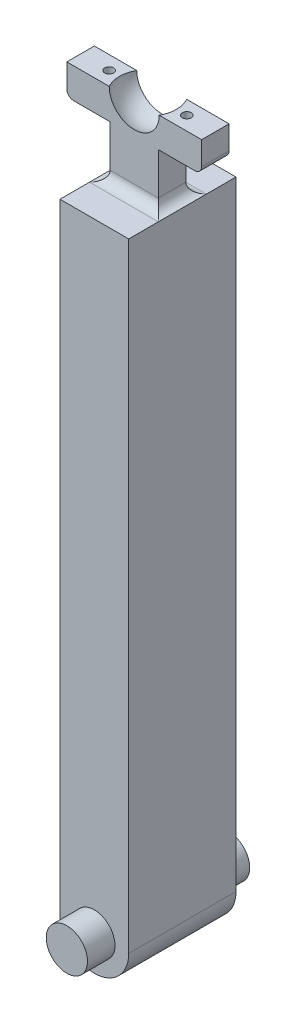
ISO-10303-21;
HEADER;
FILE_DESCRIPTION(('STEP AP214'),'2;1');
FILE_NAME('part.step','',(''),(''),'','','');
FILE_SCHEMA(('AUTOMOTIVE_DESIGN { 1 0 10303 214 1 1 1 1 }'));
ENDSEC;
DATA;
#1=APPLICATION_CONTEXT('core data for automotive mechanical design processes');
#2=APPLICATION_PROTOCOL_DEFINITION('international standard','automotive_design',2000,#1);
#3=PRODUCT_CONTEXT('',#1,'mechanical');
#4=PRODUCT('Part','Part','',(#3));
#5=PRODUCT_RELATED_PRODUCT_CATEGORY('part','',(#4));
#6=PRODUCT_DEFINITION_FORMATION('','',#4);
#7=PRODUCT_DEFINITION_CONTEXT('part definition',#1,'design');
#8=PRODUCT_DEFINITION('design','',#6,#7);
#9=PRODUCT_DEFINITION_SHAPE('','',#8);
#10=(LENGTH_UNIT() NAMED_UNIT(*) SI_UNIT(.MILLI.,.METRE.));
#11=(NAMED_UNIT(*) PLANE_ANGLE_UNIT() SI_UNIT($,.RADIAN.));
#12=(NAMED_UNIT(*) SI_UNIT($,.STERADIAN.) SOLID_ANGLE_UNIT());
#13=UNCERTAINTY_MEASURE_WITH_UNIT(LENGTH_MEASURE(1.E-05),#10,'distance_accuracy_value','');
#14=(GEOMETRIC_REPRESENTATION_CONTEXT(3) GLOBAL_UNCERTAINTY_ASSIGNED_CONTEXT((#13)) GLOBAL_UNIT_ASSIGNED_CONTEXT((#10,
#11,#12)) REPRESENTATION_CONTEXT('',''));
#15=CARTESIAN_POINT('',(0.,0.,0.));
#16=DIRECTION('',(0.,0.,1.));
#17=DIRECTION('',(1.,0.,0.));
#18=AXIS2_PLACEMENT_3D('',#15,#16,#17);
#19=CARTESIAN_POINT('',(0.,90.,7.8));
#20=DIRECTION('',(0.,-1.,0.));
#21=DIRECTION('',(0.,0.,-1.));
#22=AXIS2_PLACEMENT_3D('',#19,#20,#21);
#23=PLANE('',#22);
#24=DIRECTION('',(0.,0.,-1.));
#25=VECTOR('',#24,1.);
#26=CARTESIAN_POINT('',(5.,90.,7.8));
#27=LINE('',#26,#25);
#28=CARTESIAN_POINT('',(5.,90.,7.8));
#29=VERTEX_POINT('',#28);
#30=CARTESIAN_POINT('',(5.,90.,3.5));
#31=VERTEX_POINT('',#30);
#32=EDGE_CURVE('E258',#29,#31,#27,.T.);
#33=ORIENTED_EDGE('',*,*,#32,.T.);
#34=DIRECTION('',(1.,0.,0.));
#35=VECTOR('',#34,1.);
#36=CARTESIAN_POINT('',(0.,90.,3.5));
#37=LINE('',#36,#35);
#38=CARTESIAN_POINT('',(-5.,90.,3.5));
#39=VERTEX_POINT('',#38);
#40=EDGE_CURVE('E312',#31,#39,#37,.F.);
#41=ORIENTED_EDGE('',*,*,#40,.T.);
#42=DIRECTION('',(0.,0.,-1.));
#43=VECTOR('',#42,1.);
#44=CARTESIAN_POINT('',(-5.,90.,7.8));
#45=LINE('',#44,#43);
#46=CARTESIAN_POINT('',(-5.,90.,7.8));
#47=VERTEX_POINT('',#46);
#48=EDGE_CURVE('E272',#47,#39,#45,.T.);
#49=ORIENTED_EDGE('',*,*,#48,.F.);
#50=DIRECTION('',(-1.,0.,0.));
#51=VECTOR('',#50,1.);
#52=CARTESIAN_POINT('',(0.,90.,7.8));
#53=LINE('',#52,#51);
#54=EDGE_CURVE('E231',#29,#47,#53,.T.);
#55=ORIENTED_EDGE('',*,*,#54,.F.);
#56=EDGE_LOOP('',(#33,#41,#49,#55));
#57=FACE_BOUND('',#56,.T.);
#58=ADVANCED_FACE('F45',(#57),#23,.F.);
#59=CARTESIAN_POINT('',(-9.80000000000001,97.6,2.));
#60=DIRECTION('',(0.,1.,0.));
#61=DIRECTION('',(0.,0.,1.));
#62=AXIS2_PLACEMENT_3D('',#59,#60,#61);
#63=PLANE('',#62);
#64=DIRECTION('',(1.,0.,0.));
#65=VECTOR('',#64,1.);
#66=CARTESIAN_POINT('',(-9.80000000000001,97.6,2.));
#67=LINE('',#66,#65);
#68=CARTESIAN_POINT('',(-8.80000000000002,97.6,2.));
#69=VERTEX_POINT('',#68);
#70=CARTESIAN_POINT('',(-3.5,97.6,2.));
#71=VERTEX_POINT('',#70);
#72=EDGE_CURVE('E373',#69,#71,#67,.T.);
#73=ORIENTED_EDGE('',*,*,#72,.F.);
#74=DIRECTION('',(0.,0.,-1.));
#75=VECTOR('',#74,1.);
#76=CARTESIAN_POINT('',(-8.80000000000002,97.6,2.));
#77=LINE('',#76,#75);
#78=CARTESIAN_POINT('',(-8.80000000000002,97.6,-2.));
#79=VERTEX_POINT('',#78);
#80=EDGE_CURVE('E298',#69,#79,#77,.T.);
#81=ORIENTED_EDGE('',*,*,#80,.T.);
#82=DIRECTION('',(1.,0.,0.));
#83=VECTOR('',#82,1.);
#84=CARTESIAN_POINT('',(-9.80000000000001,97.6,-2.));
#85=LINE('',#84,#83);
#86=CARTESIAN_POINT('',(-3.5,97.6,-2.));
#87=VERTEX_POINT('',#86);
#88=EDGE_CURVE('E384',#79,#87,#85,.T.);
#89=ORIENTED_EDGE('',*,*,#88,.T.);
#90=DIRECTION('',(0.,0.,-1.));
#91=VECTOR('',#90,1.);
#92=CARTESIAN_POINT('',(-3.5,97.6,-2.));
#93=LINE('',#92,#91);
#94=EDGE_CURVE('E208',#71,#87,#93,.T.);
#95=ORIENTED_EDGE('',*,*,#94,.F.);
#96=EDGE_LOOP('',(#73,#81,#89,#95));
#97=FACE_BOUND('',#96,.T.);
#98=CARTESIAN_POINT('',(-5.65,97.6,0.));
#99=DIRECTION('',(0.,-1.,0.));
#100=DIRECTION('',(0.,0.,-1.));
#101=AXIS2_PLACEMENT_3D('',#98,#99,#100);
#102=CIRCLE('',#101,0.650000000000013);
#103=CARTESIAN_POINT('',(-5.65,97.6,-0.650000000000013));
#104=VERTEX_POINT('',#103);
#105=EDGE_CURVE('E333',#104,#104,#102,.T.);
#106=ORIENTED_EDGE('',*,*,#105,.F.);
#107=EDGE_LOOP('',(#106));
#108=FACE_BOUND('',#107,.T.);
#109=ADVANCED_FACE('F415',(#97,#108),#63,.F.);
#110=CARTESIAN_POINT('',(3.5,97.6,-2.));
#111=VERTEX_POINT('',#110);
#112=CARTESIAN_POINT('',(8.8,97.6,-2.));
#113=VERTEX_POINT('',#112);
#114=EDGE_CURVE('E383',#111,#113,#85,.T.);
#115=ORIENTED_EDGE('',*,*,#114,.T.);
#116=DIRECTION('',(0.,0.,-1.));
#117=VECTOR('',#116,1.);
#118=CARTESIAN_POINT('',(8.8,97.6,2.));
#119=LINE('',#118,#117);
#120=CARTESIAN_POINT('',(8.8,97.6,2.));
#121=VERTEX_POINT('',#120);
#122=EDGE_CURVE('E289',#113,#121,#119,.F.);
#123=ORIENTED_EDGE('',*,*,#122,.T.);
#124=CARTESIAN_POINT('',(3.5,97.6,2.));
#125=VERTEX_POINT('',#124);
#126=EDGE_CURVE('E371',#125,#121,#67,.T.);
#127=ORIENTED_EDGE('',*,*,#126,.F.);
#128=DIRECTION('',(0.,0.,1.));
#129=VECTOR('',#128,1.);
#130=CARTESIAN_POINT('',(3.5,97.6,-2.));
#131=LINE('',#130,#129);
#132=EDGE_CURVE('E182',#111,#125,#131,.T.);
#133=ORIENTED_EDGE('',*,*,#132,.F.);
#134=EDGE_LOOP('',(#115,#123,#127,#133));
#135=FACE_BOUND('',#134,.T.);
#136=CARTESIAN_POINT('',(5.64999999998962,97.6,2.67999409510405E-11));
#137=DIRECTION('',(0.,-1.,0.));
#138=DIRECTION('',(0.,0.,-1.));
#139=AXIS2_PLACEMENT_3D('',#136,#137,#138);
#140=CIRCLE('',#139,0.650000000000013);
#141=CARTESIAN_POINT('',(5.64999999998962,97.6,-0.649999999973213));
#142=VERTEX_POINT('',#141);
#143=EDGE_CURVE('E346',#142,#142,#140,.T.);
#144=ORIENTED_EDGE('',*,*,#143,.F.);
#145=EDGE_LOOP('',(#144));
#146=FACE_BOUND('',#145,.T.);
#147=ADVANCED_FACE('F465',(#135,#146),#63,.F.);
#148=CARTESIAN_POINT('',(0.,102.,0.));
#149=DIRECTION('',(0.,1.,0.));
#150=DIRECTION('',(0.,0.,1.));
#151=AXIS2_PLACEMENT_3D('',#148,#149,#150);
#152=PLANE('',#151);
#153=CARTESIAN_POINT('',(-5.65,102.,0.));
#154=DIRECTION('',(0.,1.,0.));
#155=DIRECTION('',(0.,0.,1.));
#156=AXIS2_PLACEMENT_3D('',#153,#154,#155);
#157=CIRCLE('',#156,0.650000000000013);
#158=CARTESIAN_POINT('',(-5.65,102.,0.650000000000013));
#159=VERTEX_POINT('',#158);
#160=EDGE_CURVE('E340',#159,#159,#157,.T.);
#161=ORIENTED_EDGE('',*,*,#160,.F.);
#162=EDGE_LOOP('',(#161));
#163=FACE_BOUND('',#162,.T.);
#164=DIRECTION('',(1.,0.,0.));
#165=VECTOR('',#164,1.);
#166=CARTESIAN_POINT('',(-3.5,102.,2.));
#167=LINE('',#166,#165);
#168=CARTESIAN_POINT('',(-9.80000000000001,102.,2.));
#169=VERTEX_POINT('',#168);
#170=CARTESIAN_POINT('',(-3.63627556711535,102.,2.));
#171=VERTEX_POINT('',#170);
#172=EDGE_CURVE('E200',#169,#171,#167,.T.);
#173=ORIENTED_EDGE('',*,*,#172,.T.);
#174=CARTESIAN_POINT('',(0.,102.,0.));
#175=DIRECTION('',(0.,1.,0.));
#176=DIRECTION('',(0.,0.,1.));
#177=AXIS2_PLACEMENT_3D('',#174,#175,#176);
#178=CIRCLE('',#177,4.15);
#179=CARTESIAN_POINT('',(-3.63627556711535,102.,-2.));
#180=VERTEX_POINT('',#179);
#181=EDGE_CURVE('E176',#171,#180,#178,.F.);
#182=ORIENTED_EDGE('',*,*,#181,.T.);
#183=DIRECTION('',(-1.,0.,0.));
#184=VECTOR('',#183,1.);
#185=CARTESIAN_POINT('',(-3.5,102.,-2.));
#186=LINE('',#185,#184);
#187=CARTESIAN_POINT('',(-9.80000000000001,102.,-2.));
#188=VERTEX_POINT('',#187);
#189=EDGE_CURVE('E205',#180,#188,#186,.T.);
#190=ORIENTED_EDGE('',*,*,#189,.T.);
#191=DIRECTION('',(0.,0.,-1.));
#192=VECTOR('',#191,1.);
#193=CARTESIAN_POINT('',(-9.80000000000001,102.,2.));
#194=LINE('',#193,#192);
#195=EDGE_CURVE('E379',#169,#188,#194,.T.);
#196=ORIENTED_EDGE('',*,*,#195,.F.);
#197=EDGE_LOOP('',(#173,#182,#190,#196));
#198=FACE_BOUND('',#197,.T.);
#199=ADVANCED_FACE('F401',(#163,#198),#152,.T.);
#200=CARTESIAN_POINT('',(-3.5,81.9377422517015,-2.));
#201=DIRECTION('',(-1.,0.,0.));
#202=DIRECTION('',(0.,0.,1.));
#203=AXIS2_PLACEMENT_3D('',#200,#201,#202);
#204=PLANE('',#203);
#205=DIRECTION('',(0.,1.,0.));
#206=VECTOR('',#205,1.);
#207=CARTESIAN_POINT('',(-3.5,81.9377422517015,-2.));
#208=LINE('',#207,#206);
#209=CARTESIAN_POINT('',(-3.5,91.5,-2.));
#210=VERTEX_POINT('',#209);
#211=EDGE_CURVE('E204',#210,#87,#208,.T.);
#212=ORIENTED_EDGE('',*,*,#211,.F.);
#213=DIRECTION('',(0.,0.,1.));
#214=VECTOR('',#213,1.);
#215=CARTESIAN_POINT('',(-3.5,91.5,-2.));
#216=LINE('',#215,#214);
#217=CARTESIAN_POINT('',(-3.5,91.5,2.));
#218=VERTEX_POINT('',#217);
#219=EDGE_CURVE('E55',#210,#218,#216,.T.);
#220=ORIENTED_EDGE('',*,*,#219,.T.);
#221=DIRECTION('',(0.,1.,0.));
#222=VECTOR('',#221,1.);
#223=CARTESIAN_POINT('',(-3.5,81.9377422517015,2.));
#224=LINE('',#223,#222);
#225=EDGE_CURVE('E215',#218,#71,#224,.T.);
#226=ORIENTED_EDGE('',*,*,#225,.T.);
#227=ORIENTED_EDGE('',*,*,#94,.T.);
#228=EDGE_LOOP('',(#212,#220,#226,#227));
#229=FACE_BOUND('',#228,.T.);
#230=ADVANCED_FACE('F477',(#229),#204,.T.);
#231=CARTESIAN_POINT('',(3.5,81.9377422517015,-2.));
#232=DIRECTION('',(1.,0.,0.));
#233=DIRECTION('',(0.,0.,-1.));
#234=AXIS2_PLACEMENT_3D('',#231,#232,#233);
#235=PLANE('',#234);
#236=DIRECTION('',(0.,1.,0.));
#237=VECTOR('',#236,1.);
#238=CARTESIAN_POINT('',(3.5,81.9377422517015,2.));
#239=LINE('',#238,#237);
#240=CARTESIAN_POINT('',(3.5,91.5,2.));
#241=VERTEX_POINT('',#240);
#242=EDGE_CURVE('E211',#241,#125,#239,.T.);
#243=ORIENTED_EDGE('',*,*,#242,.F.);
#244=DIRECTION('',(0.,0.,-1.));
#245=VECTOR('',#244,1.);
#246=CARTESIAN_POINT('',(3.5,91.5,-2.));
#247=LINE('',#246,#245);
#248=CARTESIAN_POINT('',(3.5,91.5,-2.));
#249=VERTEX_POINT('',#248);
#250=EDGE_CURVE('E305',#241,#249,#247,.T.);
#251=ORIENTED_EDGE('',*,*,#250,.T.);
#252=DIRECTION('',(0.,1.,0.));
#253=VECTOR('',#252,1.);
#254=CARTESIAN_POINT('',(3.5,81.9377422517015,-2.));
#255=LINE('',#254,#253);
#256=EDGE_CURVE('E214',#249,#111,#255,.T.);
#257=ORIENTED_EDGE('',*,*,#256,.T.);
#258=ORIENTED_EDGE('',*,*,#132,.T.);
#259=EDGE_LOOP('',(#243,#251,#257,#258));
#260=FACE_BOUND('',#259,.T.);
#261=ADVANCED_FACE('F430',(#260),#235,.T.);
#262=CARTESIAN_POINT('',(-5.,90.,-3.5));
#263=VERTEX_POINT('',#262);
#264=CARTESIAN_POINT('',(-5.,90.,-7.8));
#265=VERTEX_POINT('',#264);
#266=EDGE_CURVE('E271',#263,#265,#45,.T.);
#267=ORIENTED_EDGE('',*,*,#266,.F.);
#268=DIRECTION('',(-1.,0.,0.));
#269=VECTOR('',#268,1.);
#270=CARTESIAN_POINT('',(0.,90.,-3.5));
#271=LINE('',#270,#269);
#272=CARTESIAN_POINT('',(5.,90.,-3.5));
#273=VERTEX_POINT('',#272);
#274=EDGE_CURVE('E309',#263,#273,#271,.F.);
#275=ORIENTED_EDGE('',*,*,#274,.T.);
#276=CARTESIAN_POINT('',(5.,90.,-7.8));
#277=VERTEX_POINT('',#276);
#278=EDGE_CURVE('E245',#273,#277,#27,.T.);
#279=ORIENTED_EDGE('',*,*,#278,.T.);
#280=DIRECTION('',(-1.,0.,0.));
#281=VECTOR('',#280,1.);
#282=CARTESIAN_POINT('',(0.,90.,-7.8));
#283=LINE('',#282,#281);
#284=EDGE_CURVE('E227',#277,#265,#283,.T.);
#285=ORIENTED_EDGE('',*,*,#284,.T.);
#286=EDGE_LOOP('',(#267,#275,#279,#285));
#287=FACE_BOUND('',#286,.T.);
#288=ADVANCED_FACE('F461',(#287),#23,.F.);
#289=CARTESIAN_POINT('',(-5.,0.,7.8));
#290=DIRECTION('',(1.,0.,0.));
#291=DIRECTION('',(0.,0.,-1.));
#292=AXIS2_PLACEMENT_3D('',#289,#290,#291);
#293=PLANE('',#292);
#294=DIRECTION('',(0.,-1.,0.));
#295=VECTOR('',#294,1.);
#296=CARTESIAN_POINT('',(-5.,0.,-7.8));
#297=LINE('',#296,#295);
#298=CARTESIAN_POINT('',(-5.,0.,-7.8));
#299=VERTEX_POINT('',#298);
#300=EDGE_CURVE('E249',#265,#299,#297,.T.);
#301=ORIENTED_EDGE('',*,*,#300,.T.);
#302=DIRECTION('',(0.,0.,-1.));
#303=VECTOR('',#302,1.);
#304=CARTESIAN_POINT('',(-5.,0.,7.8));
#305=LINE('',#304,#303);
#306=CARTESIAN_POINT('',(-5.,0.,7.8));
#307=VERTEX_POINT('',#306);
#308=EDGE_CURVE('E267',#307,#299,#305,.T.);
#309=ORIENTED_EDGE('',*,*,#308,.F.);
#310=DIRECTION('',(0.,-1.,0.));
#311=VECTOR('',#310,1.);
#312=CARTESIAN_POINT('',(-5.,0.,7.8));
#313=LINE('',#312,#311);
#314=EDGE_CURVE('E235',#47,#307,#313,.T.);
#315=ORIENTED_EDGE('',*,*,#314,.F.);
#316=ORIENTED_EDGE('',*,*,#48,.T.);
#317=EDGE_CURVE('E276',#39,#263,#45,.T.);
#318=ORIENTED_EDGE('',*,*,#317,.T.);
#319=ORIENTED_EDGE('',*,*,#266,.T.);
#320=EDGE_LOOP('',(#301,#309,#315,#316,#318,#319));
#321=FACE_BOUND('',#320,.T.);
#322=ADVANCED_FACE('F469',(#321),#293,.F.);
#323=CARTESIAN_POINT('',(0.,0.,7.8));
#324=DIRECTION('',(0.,0.,-1.));
#325=DIRECTION('',(-1.,0.,0.));
#326=AXIS2_PLACEMENT_3D('',#323,#324,#325);
#327=CYLINDRICAL_SURFACE('',#326,5.);
#328=CARTESIAN_POINT('',(0.,0.,-7.8));
#329=DIRECTION('',(0.,0.,1.));
#330=DIRECTION('',(1.,0.,0.));
#331=AXIS2_PLACEMENT_3D('',#328,#329,#330);
#332=CIRCLE('',#331,5.);
#333=CARTESIAN_POINT('',(5.,0.,-7.8));
#334=VERTEX_POINT('',#333);
#335=EDGE_CURVE('E252',#299,#334,#332,.T.);
#336=ORIENTED_EDGE('',*,*,#335,.T.);
#337=DIRECTION('',(0.,0.,-1.));
#338=VECTOR('',#337,1.);
#339=CARTESIAN_POINT('',(5.,0.,7.8));
#340=LINE('',#339,#338);
#341=CARTESIAN_POINT('',(5.,0.,7.8));
#342=VERTEX_POINT('',#341);
#343=EDGE_CURVE('E262',#342,#334,#340,.T.);
#344=ORIENTED_EDGE('',*,*,#343,.F.);
#345=CARTESIAN_POINT('',(0.,0.,7.8));
#346=DIRECTION('',(0.,0.,1.));
#347=DIRECTION('',(1.,0.,0.));
#348=AXIS2_PLACEMENT_3D('',#345,#346,#347);
#349=CIRCLE('',#348,5.);
#350=EDGE_CURVE('E239',#307,#342,#349,.T.);
#351=ORIENTED_EDGE('',*,*,#350,.F.);
#352=ORIENTED_EDGE('',*,*,#308,.T.);
#353=EDGE_LOOP('',(#336,#344,#351,#352));
#354=FACE_BOUND('',#353,.T.);
#355=ADVANCED_FACE('F475',(#354),#327,.T.);
#356=CARTESIAN_POINT('',(5.,0.,7.8));
#357=DIRECTION('',(-1.,0.,0.));
#358=DIRECTION('',(0.,0.,1.));
#359=AXIS2_PLACEMENT_3D('',#356,#357,#358);
#360=PLANE('',#359);
#361=DIRECTION('',(0.,1.,0.));
#362=VECTOR('',#361,1.);
#363=CARTESIAN_POINT('',(5.,0.,-7.8));
#364=LINE('',#363,#362);
#365=EDGE_CURVE('E236',#334,#277,#364,.T.);
#366=ORIENTED_EDGE('',*,*,#365,.T.);
#367=ORIENTED_EDGE('',*,*,#278,.F.);
#368=EDGE_CURVE('E263',#31,#273,#27,.T.);
#369=ORIENTED_EDGE('',*,*,#368,.F.);
#370=ORIENTED_EDGE('',*,*,#32,.F.);
#371=DIRECTION('',(0.,1.,0.));
#372=VECTOR('',#371,1.);
#373=CARTESIAN_POINT('',(5.,0.,7.8));
#374=LINE('',#373,#372);
#375=EDGE_CURVE('E242',#342,#29,#374,.T.);
#376=ORIENTED_EDGE('',*,*,#375,.F.);
#377=ORIENTED_EDGE('',*,*,#343,.T.);
#378=EDGE_LOOP('',(#366,#367,#369,#370,#376,#377));
#379=FACE_BOUND('',#378,.T.);
#380=ADVANCED_FACE('F653',(#379),#360,.F.);
#381=CARTESIAN_POINT('',(0.,0.,7.8));
#382=DIRECTION('',(0.,0.,1.));
#383=DIRECTION('',(1.,0.,0.));
#384=AXIS2_PLACEMENT_3D('',#381,#382,#383);
#385=PLANE('',#384);
#386=CARTESIAN_POINT('',(0.,0.,7.8));
#387=DIRECTION('',(0.,0.,1.));
#388=DIRECTION('',(1.,0.,0.));
#389=AXIS2_PLACEMENT_3D('',#386,#387,#388);
#390=CIRCLE('',#389,3.);
#391=CARTESIAN_POINT('',(3.,0.,7.8));
#392=VERTEX_POINT('',#391);
#393=EDGE_CURVE('E222',#392,#392,#390,.T.);
#394=ORIENTED_EDGE('',*,*,#393,.F.);
#395=EDGE_LOOP('',(#394));
#396=FACE_BOUND('',#395,.T.);
#397=ORIENTED_EDGE('',*,*,#54,.T.);
#398=ORIENTED_EDGE('',*,*,#314,.T.);
#399=ORIENTED_EDGE('',*,*,#350,.T.);
#400=ORIENTED_EDGE('',*,*,#375,.T.);
#401=EDGE_LOOP('',(#397,#398,#399,#400));
#402=FACE_BOUND('',#401,.T.);
#403=ADVANCED_FACE('F658',(#396,#402),#385,.T.);
#404=CARTESIAN_POINT('',(0.,0.,-7.8));
#405=DIRECTION('',(0.,0.,1.));
#406=DIRECTION('',(1.,0.,0.));
#407=AXIS2_PLACEMENT_3D('',#404,#405,#406);
#408=PLANE('',#407);
#409=CARTESIAN_POINT('',(0.,0.,-7.8));
#410=DIRECTION('',(0.,0.,1.));
#411=DIRECTION('',(1.,0.,0.));
#412=AXIS2_PLACEMENT_3D('',#409,#410,#411);
#413=CIRCLE('',#412,3.);
#414=CARTESIAN_POINT('',(3.,0.,-7.8));
#415=VERTEX_POINT('',#414);
#416=EDGE_CURVE('E356',#415,#415,#413,.T.);
#417=ORIENTED_EDGE('',*,*,#416,.T.);
#418=EDGE_LOOP('',(#417));
#419=FACE_BOUND('',#418,.T.);
#420=ORIENTED_EDGE('',*,*,#284,.F.);
#421=ORIENTED_EDGE('',*,*,#365,.F.);
#422=ORIENTED_EDGE('',*,*,#335,.F.);
#423=ORIENTED_EDGE('',*,*,#300,.F.);
#424=EDGE_LOOP('',(#420,#421,#422,#423));
#425=FACE_BOUND('',#424,.T.);
#426=ADVANCED_FACE('F529',(#419,#425),#408,.F.);
#427=CARTESIAN_POINT('',(0.,0.,11.8));
#428=DIRECTION('',(0.,0.,-1.));
#429=DIRECTION('',(-1.,0.,0.));
#430=AXIS2_PLACEMENT_3D('',#427,#428,#429);
#431=CYLINDRICAL_SURFACE('',#430,3.);
#432=CARTESIAN_POINT('',(0.,0.,11.8));
#433=DIRECTION('',(0.,0.,1.));
#434=DIRECTION('',(1.,0.,0.));
#435=AXIS2_PLACEMENT_3D('',#432,#433,#434);
#436=CIRCLE('',#435,3.);
#437=CARTESIAN_POINT('',(3.,0.,11.8));
#438=VERTEX_POINT('',#437);
#439=EDGE_CURVE('E223',#438,#438,#436,.T.);
#440=ORIENTED_EDGE('',*,*,#439,.F.);
#441=EDGE_LOOP('',(#440));
#442=FACE_BOUND('',#441,.T.);
#443=ORIENTED_EDGE('',*,*,#393,.T.);
#444=EDGE_LOOP('',(#443));
#445=FACE_BOUND('',#444,.T.);
#446=ADVANCED_FACE('F731',(#442,#445),#431,.T.);
#447=CARTESIAN_POINT('',(0.,0.,11.8));
#448=DIRECTION('',(0.,0.,1.));
#449=DIRECTION('',(1.,0.,0.));
#450=AXIS2_PLACEMENT_3D('',#447,#448,#449);
#451=PLANE('',#450);
#452=ORIENTED_EDGE('',*,*,#439,.T.);
#453=EDGE_LOOP('',(#452));
#454=FACE_BOUND('',#453,.T.);
#455=ADVANCED_FACE('F592',(#454),#451,.T.);
#456=CARTESIAN_POINT('',(5.64999999998962,102.,2.67999409510405E-11));
#457=DIRECTION('',(0.,1.,0.));
#458=DIRECTION('',(0.,0.,1.));
#459=AXIS2_PLACEMENT_3D('',#456,#457,#458);
#460=CIRCLE('',#459,0.650000000000013);
#461=CARTESIAN_POINT('',(5.64999999998962,102.,0.650000000026813));
#462=VERTEX_POINT('',#461);
#463=EDGE_CURVE('E352',#462,#462,#460,.T.);
#464=ORIENTED_EDGE('',*,*,#463,.F.);
#465=EDGE_LOOP('',(#464));
#466=FACE_BOUND('',#465,.T.);
#467=CARTESIAN_POINT('',(9.80000000000001,102.,-2.));
#468=VERTEX_POINT('',#467);
#469=CARTESIAN_POINT('',(3.63627556711534,102.,-2.));
#470=VERTEX_POINT('',#469);
#471=EDGE_CURVE('E192',#468,#470,#186,.T.);
#472=ORIENTED_EDGE('',*,*,#471,.T.);
#473=CARTESIAN_POINT('',(3.63627556711534,102.,2.));
#474=VERTEX_POINT('',#473);
#475=EDGE_CURVE('E173',#470,#474,#178,.F.);
#476=ORIENTED_EDGE('',*,*,#475,.T.);
#477=CARTESIAN_POINT('',(9.80000000000001,102.,2.));
#478=VERTEX_POINT('',#477);
#479=EDGE_CURVE('E189',#474,#478,#167,.T.);
#480=ORIENTED_EDGE('',*,*,#479,.T.);
#481=DIRECTION('',(0.,0.,-1.));
#482=VECTOR('',#481,1.);
#483=CARTESIAN_POINT('',(9.80000000000001,102.,2.));
#484=LINE('',#483,#482);
#485=EDGE_CURVE('E392',#478,#468,#484,.T.);
#486=ORIENTED_EDGE('',*,*,#485,.T.);
#487=EDGE_LOOP('',(#472,#476,#480,#486));
#488=FACE_BOUND('',#487,.T.);
#489=ADVANCED_FACE('F187',(#466,#488),#152,.T.);
#490=CARTESIAN_POINT('',(-3.5,81.9377422517015,-2.));
#491=DIRECTION('',(0.,0.,-1.));
#492=DIRECTION('',(-1.,0.,0.));
#493=AXIS2_PLACEMENT_3D('',#490,#491,#492);
#494=PLANE('',#493);
#495=ORIENTED_EDGE('',*,*,#256,.F.);
#496=DIRECTION('',(-1.,0.,0.));
#497=VECTOR('',#496,1.);
#498=CARTESIAN_POINT('',(-3.5,91.5,-2.));
#499=LINE('',#498,#497);
#500=EDGE_CURVE('E11',#249,#210,#499,.T.);
#501=ORIENTED_EDGE('',*,*,#500,.T.);
#502=ORIENTED_EDGE('',*,*,#211,.T.);
#503=ORIENTED_EDGE('',*,*,#88,.F.);
#504=CARTESIAN_POINT('',(-8.80000000000002,98.6,-2.));
#505=DIRECTION('',(0.,0.,-1.));
#506=DIRECTION('',(-1.,0.,0.));
#507=AXIS2_PLACEMENT_3D('',#504,#505,#506);
#508=CIRCLE('',#507,1.);
#509=CARTESIAN_POINT('',(-9.80000000000001,98.6,-2.));
#510=VERTEX_POINT('',#509);
#511=EDGE_CURVE('E283',#79,#510,#508,.T.);
#512=ORIENTED_EDGE('',*,*,#511,.T.);
#513=DIRECTION('',(0.,-1.,0.));
#514=VECTOR('',#513,1.);
#515=CARTESIAN_POINT('',(-9.80000000000001,102.,-2.));
#516=LINE('',#515,#514);
#517=EDGE_CURVE('E366',#188,#510,#516,.T.);
#518=ORIENTED_EDGE('',*,*,#517,.F.);
#519=ORIENTED_EDGE('',*,*,#189,.F.);
#520=CARTESIAN_POINT('',(0.,102.,-2.));
#521=DIRECTION('',(0.,0.,-1.));
#522=DIRECTION('',(-1.,0.,0.));
#523=AXIS2_PLACEMENT_3D('',#520,#521,#522);
#524=CIRCLE('',#523,3.63627556711534);
#525=EDGE_CURVE('E363',#180,#470,#524,.F.);
#526=ORIENTED_EDGE('',*,*,#525,.T.);
#527=ORIENTED_EDGE('',*,*,#471,.F.);
#528=DIRECTION('',(0.,1.,0.));
#529=VECTOR('',#528,1.);
#530=CARTESIAN_POINT('',(9.80000000000001,102.,-2.));
#531=LINE('',#530,#529);
#532=CARTESIAN_POINT('',(9.79999999999999,98.6,-2.));
#533=VERTEX_POINT('',#532);
#534=EDGE_CURVE('E372',#533,#468,#531,.T.);
#535=ORIENTED_EDGE('',*,*,#534,.F.);
#536=CARTESIAN_POINT('',(8.8,98.6,-2.));
#537=DIRECTION('',(0.,0.,-1.));
#538=DIRECTION('',(-1.,0.,0.));
#539=AXIS2_PLACEMENT_3D('',#536,#537,#538);
#540=CIRCLE('',#539,1.);
#541=EDGE_CURVE('E286',#533,#113,#540,.T.);
#542=ORIENTED_EDGE('',*,*,#541,.T.);
#543=ORIENTED_EDGE('',*,*,#114,.F.);
#544=EDGE_LOOP('',(#495,#501,#502,#503,#512,#518,#519,#526,#527,#535,#542,#543));
#545=FACE_BOUND('',#544,.T.);
#546=ADVANCED_FACE('F407',(#545),#494,.T.);
#547=CARTESIAN_POINT('',(-3.5,81.9377422517015,2.));
#548=DIRECTION('',(0.,0.,1.));
#549=DIRECTION('',(1.,0.,0.));
#550=AXIS2_PLACEMENT_3D('',#547,#548,#549);
#551=PLANE('',#550);
#552=ORIENTED_EDGE('',*,*,#225,.F.);
#553=DIRECTION('',(1.,0.,0.));
#554=VECTOR('',#553,1.);
#555=CARTESIAN_POINT('',(-3.5,91.5,2.));
#556=LINE('',#555,#554);
#557=EDGE_CURVE('E315',#218,#241,#556,.T.);
#558=ORIENTED_EDGE('',*,*,#557,.T.);
#559=ORIENTED_EDGE('',*,*,#242,.T.);
#560=ORIENTED_EDGE('',*,*,#126,.T.);
#561=CARTESIAN_POINT('',(8.8,98.6,2.));
#562=DIRECTION('',(0.,0.,1.));
#563=DIRECTION('',(1.,0.,0.));
#564=AXIS2_PLACEMENT_3D('',#561,#562,#563);
#565=CIRCLE('',#564,1.);
#566=CARTESIAN_POINT('',(9.79999999999999,98.6,2.));
#567=VERTEX_POINT('',#566);
#568=EDGE_CURVE('E295',#121,#567,#565,.T.);
#569=ORIENTED_EDGE('',*,*,#568,.T.);
#570=DIRECTION('',(0.,1.,0.));
#571=VECTOR('',#570,1.);
#572=CARTESIAN_POINT('',(9.80000000000001,102.,2.));
#573=LINE('',#572,#571);
#574=EDGE_CURVE('E198',#567,#478,#573,.T.);
#575=ORIENTED_EDGE('',*,*,#574,.T.);
#576=ORIENTED_EDGE('',*,*,#479,.F.);
#577=CARTESIAN_POINT('',(0.,102.,2.));
#578=DIRECTION('',(0.,0.,1.));
#579=DIRECTION('',(1.,0.,0.));
#580=AXIS2_PLACEMENT_3D('',#577,#578,#579);
#581=CIRCLE('',#580,3.63627556711534);
#582=EDGE_CURVE('E170',#474,#171,#581,.F.);
#583=ORIENTED_EDGE('',*,*,#582,.T.);
#584=ORIENTED_EDGE('',*,*,#172,.F.);
#585=DIRECTION('',(0.,-1.,0.));
#586=VECTOR('',#585,1.);
#587=CARTESIAN_POINT('',(-9.80000000000001,102.,2.));
#588=LINE('',#587,#586);
#589=CARTESIAN_POINT('',(-9.80000000000001,98.6,2.));
#590=VERTEX_POINT('',#589);
#591=EDGE_CURVE('E367',#169,#590,#588,.T.);
#592=ORIENTED_EDGE('',*,*,#591,.T.);
#593=CARTESIAN_POINT('',(-8.80000000000002,98.6,2.));
#594=DIRECTION('',(0.,0.,1.));
#595=DIRECTION('',(1.,0.,0.));
#596=AXIS2_PLACEMENT_3D('',#593,#594,#595);
#597=CIRCLE('',#596,1.);
#598=EDGE_CURVE('E292',#590,#69,#597,.T.);
#599=ORIENTED_EDGE('',*,*,#598,.T.);
#600=ORIENTED_EDGE('',*,*,#72,.T.);
#601=EDGE_LOOP('',(#552,#558,#559,#560,#569,#575,#576,#583,#584,#592,#599,#600));
#602=FACE_BOUND('',#601,.T.);
#603=ADVANCED_FACE('F196',(#602),#551,.T.);
#604=CARTESIAN_POINT('',(9.80000000000001,102.,2.));
#605=DIRECTION('',(-1.,0.,0.));
#606=DIRECTION('',(0.,-1.,0.));
#607=AXIS2_PLACEMENT_3D('',#604,#605,#606);
#608=PLANE('',#607);
#609=ORIENTED_EDGE('',*,*,#574,.F.);
#610=DIRECTION('',(0.,0.,-1.));
#611=VECTOR('',#610,1.);
#612=CARTESIAN_POINT('',(9.79999999999999,98.6,2.));
#613=LINE('',#612,#611);
#614=EDGE_CURVE('E181',#567,#533,#613,.T.);
#615=ORIENTED_EDGE('',*,*,#614,.T.);
#616=ORIENTED_EDGE('',*,*,#534,.T.);
#617=ORIENTED_EDGE('',*,*,#485,.F.);
#618=EDGE_LOOP('',(#609,#615,#616,#617));
#619=FACE_BOUND('',#618,.T.);
#620=ADVANCED_FACE('F447',(#619),#608,.F.);
#621=CARTESIAN_POINT('',(-9.80000000000001,102.,2.));
#622=DIRECTION('',(1.,0.,0.));
#623=DIRECTION('',(0.,0.,-1.));
#624=AXIS2_PLACEMENT_3D('',#621,#622,#623);
#625=PLANE('',#624);
#626=ORIENTED_EDGE('',*,*,#517,.T.);
#627=DIRECTION('',(0.,0.,-1.));
#628=VECTOR('',#627,1.);
#629=CARTESIAN_POINT('',(-9.80000000000001,98.6,2.));
#630=LINE('',#629,#628);
#631=EDGE_CURVE('E302',#510,#590,#630,.F.);
#632=ORIENTED_EDGE('',*,*,#631,.T.);
#633=ORIENTED_EDGE('',*,*,#591,.F.);
#634=ORIENTED_EDGE('',*,*,#195,.T.);
#635=EDGE_LOOP('',(#626,#632,#633,#634));
#636=FACE_BOUND('',#635,.T.);
#637=ADVANCED_FACE('F405',(#636),#625,.F.);
#638=CARTESIAN_POINT('',(0.,102.,0.));
#639=DIRECTION('',(0.,1.,0.));
#640=DIRECTION('',(1.,0.,0.));
#641=AXIS2_PLACEMENT_3D('',#638,#639,#640);
#642=SPHERICAL_SURFACE('',#641,4.15);
#643=ORIENTED_EDGE('',*,*,#181,.F.);
#644=ORIENTED_EDGE('',*,*,#582,.F.);
#645=ORIENTED_EDGE('',*,*,#475,.F.);
#646=ORIENTED_EDGE('',*,*,#525,.F.);
#647=EDGE_LOOP('',(#643,#644,#645,#646));
#648=FACE_BOUND('',#647,.T.);
#649=ADVANCED_FACE('F172',(#648),#642,.F.);
#650=CARTESIAN_POINT('',(0.,0.,-11.8));
#651=DIRECTION('',(0.,0.,1.));
#652=DIRECTION('',(1.,0.,0.));
#653=AXIS2_PLACEMENT_3D('',#650,#651,#652);
#654=CYLINDRICAL_SURFACE('',#653,3.);
#655=CARTESIAN_POINT('',(0.,0.,-11.8));
#656=DIRECTION('',(0.,0.,1.));
#657=DIRECTION('',(1.,0.,0.));
#658=AXIS2_PLACEMENT_3D('',#655,#656,#657);
#659=CIRCLE('',#658,3.);
#660=CARTESIAN_POINT('',(3.,0.,-11.8));
#661=VERTEX_POINT('',#660);
#662=EDGE_CURVE('E194',#661,#661,#659,.T.);
#663=ORIENTED_EDGE('',*,*,#662,.T.);
#664=EDGE_LOOP('',(#663));
#665=FACE_BOUND('',#664,.T.);
#666=ORIENTED_EDGE('',*,*,#416,.F.);
#667=EDGE_LOOP('',(#666));
#668=FACE_BOUND('',#667,.T.);
#669=ADVANCED_FACE('F501',(#665,#668),#654,.T.);
#670=CARTESIAN_POINT('',(0.,0.,-11.8));
#671=DIRECTION('',(0.,0.,-1.));
#672=DIRECTION('',(1.,0.,0.));
#673=AXIS2_PLACEMENT_3D('',#670,#671,#672);
#674=PLANE('',#673);
#675=ORIENTED_EDGE('',*,*,#662,.F.);
#676=EDGE_LOOP('',(#675));
#677=FACE_BOUND('',#676,.T.);
#678=ADVANCED_FACE('F497',(#677),#674,.T.);
#679=CARTESIAN_POINT('',(8.8,98.6,2.));
#680=DIRECTION('',(0.,0.,-1.));
#681=DIRECTION('',(-1.,0.,0.));
#682=AXIS2_PLACEMENT_3D('',#679,#680,#681);
#683=CYLINDRICAL_SURFACE('',#682,1.);
#684=ORIENTED_EDGE('',*,*,#568,.F.);
#685=ORIENTED_EDGE('',*,*,#122,.F.);
#686=ORIENTED_EDGE('',*,*,#541,.F.);
#687=ORIENTED_EDGE('',*,*,#614,.F.);
#688=EDGE_LOOP('',(#684,#685,#686,#687));
#689=FACE_BOUND('',#688,.T.);
#690=ADVANCED_FACE('F445',(#689),#683,.T.);
#691=CARTESIAN_POINT('',(-8.80000000000002,98.6,2.));
#692=DIRECTION('',(0.,0.,-1.));
#693=DIRECTION('',(-1.,0.,0.));
#694=AXIS2_PLACEMENT_3D('',#691,#692,#693);
#695=CYLINDRICAL_SURFACE('',#694,1.);
#696=ORIENTED_EDGE('',*,*,#598,.F.);
#697=ORIENTED_EDGE('',*,*,#631,.F.);
#698=ORIENTED_EDGE('',*,*,#511,.F.);
#699=ORIENTED_EDGE('',*,*,#80,.F.);
#700=EDGE_LOOP('',(#696,#697,#698,#699));
#701=FACE_BOUND('',#700,.T.);
#702=ADVANCED_FACE('F412',(#701),#695,.T.);
#703=CARTESIAN_POINT('',(5.64999999998962,97.6,2.67999409510405E-11));
#704=DIRECTION('',(0.,-1.,0.));
#705=DIRECTION('',(0.,0.,-1.));
#706=AXIS2_PLACEMENT_3D('',#703,#704,#705);
#707=CYLINDRICAL_SURFACE('',#706,0.650000000000013);
#708=ORIENTED_EDGE('',*,*,#143,.T.);
#709=EDGE_LOOP('',(#708));
#710=FACE_BOUND('',#709,.T.);
#711=ORIENTED_EDGE('',*,*,#463,.T.);
#712=EDGE_LOOP('',(#711));
#713=FACE_BOUND('',#712,.T.);
#714=ADVANCED_FACE('F495',(#710,#713),#707,.F.);
#715=CARTESIAN_POINT('',(-5.65,97.6,0.));
#716=DIRECTION('',(0.,-1.,0.));
#717=DIRECTION('',(0.,0.,-1.));
#718=AXIS2_PLACEMENT_3D('',#715,#716,#717);
#719=CYLINDRICAL_SURFACE('',#718,0.650000000000013);
#720=ORIENTED_EDGE('',*,*,#105,.T.);
#721=EDGE_LOOP('',(#720));
#722=FACE_BOUND('',#721,.T.);
#723=ORIENTED_EDGE('',*,*,#160,.T.);
#724=EDGE_LOOP('',(#723));
#725=FACE_BOUND('',#724,.T.);
#726=ADVANCED_FACE('F605',(#722,#725),#719,.F.);
#727=CARTESIAN_POINT('',(-5.,91.5,-2.));
#728=DIRECTION('',(0.,0.,1.));
#729=DIRECTION('',(1.,0.,0.));
#730=AXIS2_PLACEMENT_3D('',#727,#728,#729);
#731=CYLINDRICAL_SURFACE('',#730,1.5);
#732=CARTESIAN_POINT('',(-5.,91.5,-3.5));
#733=DIRECTION('',(-0.707106781186547,0.,0.707106781186547));
#734=DIRECTION('',(-0.707106781186547,0.,-0.707106781186547));
#735=AXIS2_PLACEMENT_3D('',#732,#733,#734);
#736=ELLIPSE('',#735,2.12132034355964,1.5);
#737=EDGE_CURVE('E325',#263,#210,#736,.T.);
#738=ORIENTED_EDGE('',*,*,#737,.F.);
#739=ORIENTED_EDGE('',*,*,#317,.F.);
#740=CARTESIAN_POINT('',(-5.,91.5,3.5));
#741=DIRECTION('',(0.707106781186547,0.,0.707106781186547));
#742=DIRECTION('',(-0.707106781186547,0.,0.707106781186547));
#743=AXIS2_PLACEMENT_3D('',#740,#741,#742);
#744=ELLIPSE('',#743,2.12132034355964,1.5);
#745=EDGE_CURVE('E49',#218,#39,#744,.F.);
#746=ORIENTED_EDGE('',*,*,#745,.F.);
#747=ORIENTED_EDGE('',*,*,#219,.F.);
#748=EDGE_LOOP('',(#738,#739,#746,#747));
#749=FACE_BOUND('',#748,.T.);
#750=ADVANCED_FACE('F47',(#749),#731,.F.);
#751=CARTESIAN_POINT('',(-3.5,91.5,3.5));
#752=DIRECTION('',(1.,0.,0.));
#753=DIRECTION('',(0.,0.,-1.));
#754=AXIS2_PLACEMENT_3D('',#751,#752,#753);
#755=CYLINDRICAL_SURFACE('',#754,1.5);
#756=ORIENTED_EDGE('',*,*,#745,.T.);
#757=ORIENTED_EDGE('',*,*,#40,.F.);
#758=CARTESIAN_POINT('',(5.,91.5,3.5));
#759=DIRECTION('',(0.707106781186547,0.,-0.707106781186548));
#760=DIRECTION('',(0.707106781186547,0.,0.707106781186547));
#761=AXIS2_PLACEMENT_3D('',#758,#759,#760);
#762=ELLIPSE('',#761,2.12132034355964,1.5);
#763=EDGE_CURVE('E323',#241,#31,#762,.F.);
#764=ORIENTED_EDGE('',*,*,#763,.F.);
#765=ORIENTED_EDGE('',*,*,#557,.F.);
#766=EDGE_LOOP('',(#756,#757,#764,#765));
#767=FACE_BOUND('',#766,.T.);
#768=ADVANCED_FACE('F422',(#767),#755,.F.);
#769=CARTESIAN_POINT('',(-3.5,91.5,-3.5));
#770=DIRECTION('',(-1.,0.,0.));
#771=DIRECTION('',(0.,0.,1.));
#772=AXIS2_PLACEMENT_3D('',#769,#770,#771);
#773=CYLINDRICAL_SURFACE('',#772,1.5);
#774=ORIENTED_EDGE('',*,*,#737,.T.);
#775=ORIENTED_EDGE('',*,*,#500,.F.);
#776=CARTESIAN_POINT('',(5.,91.5,-3.5));
#777=DIRECTION('',(-0.707106781186547,0.,-0.707106781186547));
#778=DIRECTION('',(-0.707106781186547,0.,0.707106781186548));
#779=AXIS2_PLACEMENT_3D('',#776,#777,#778);
#780=ELLIPSE('',#779,2.12132034355964,1.5);
#781=EDGE_CURVE('E320',#273,#249,#780,.T.);
#782=ORIENTED_EDGE('',*,*,#781,.F.);
#783=ORIENTED_EDGE('',*,*,#274,.F.);
#784=EDGE_LOOP('',(#774,#775,#782,#783));
#785=FACE_BOUND('',#784,.T.);
#786=ADVANCED_FACE('F485',(#785),#773,.F.);
#787=CARTESIAN_POINT('',(5.,91.5,-2.));
#788=DIRECTION('',(0.,0.,-1.));
#789=DIRECTION('',(-1.,0.,0.));
#790=AXIS2_PLACEMENT_3D('',#787,#788,#789);
#791=CYLINDRICAL_SURFACE('',#790,1.5);
#792=ORIENTED_EDGE('',*,*,#763,.T.);
#793=ORIENTED_EDGE('',*,*,#368,.T.);
#794=ORIENTED_EDGE('',*,*,#781,.T.);
#795=ORIENTED_EDGE('',*,*,#250,.F.);
#796=EDGE_LOOP('',(#792,#793,#794,#795));
#797=FACE_BOUND('',#796,.T.);
#798=ADVANCED_FACE('F427',(#797),#791,.F.);
#799=CLOSED_SHELL('',(#58,#109,#147,#199,#230,#261,#288,#322,#355,#380,#403,#426,#446,#455,#489,
#546,#603,#620,#637,#649,#669,#678,#690,#702,#714,#726,#750,#768,#786,#798));
#800=MANIFOLD_SOLID_BREP('B2',#799);
#801=ADVANCED_BREP_SHAPE_REPRESENTATION('',(#18,#800),#14);
#802=SHAPE_DEFINITION_REPRESENTATION(#9,#801);
ENDSEC;
END-ISO-10303-21;
